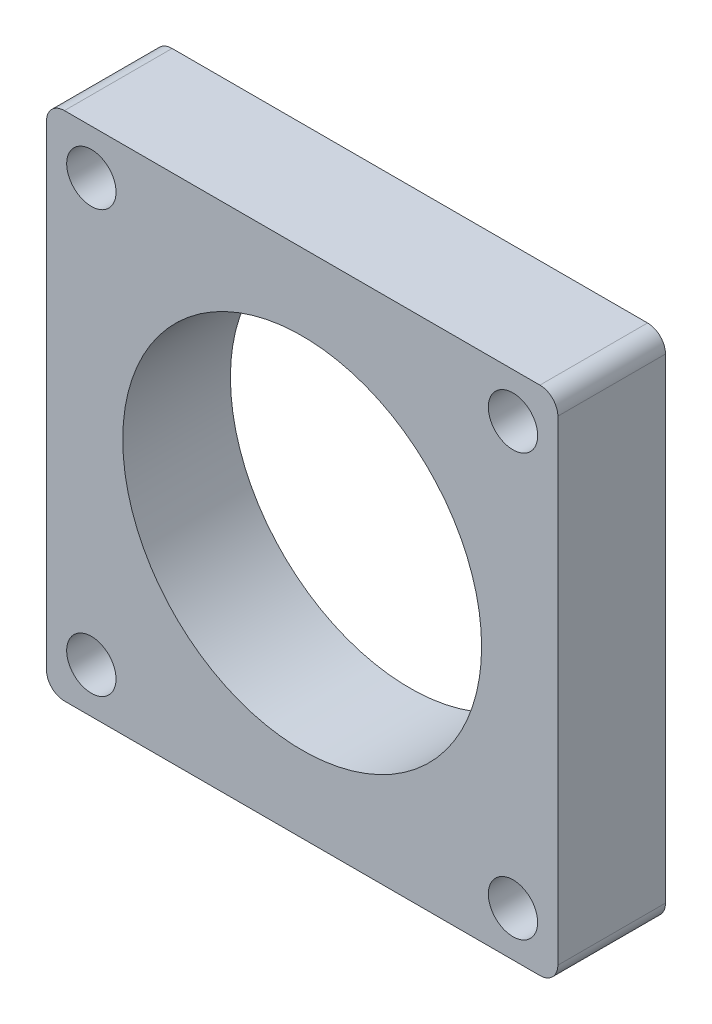
ISO-10303-21;
HEADER;
FILE_DESCRIPTION(('STEP AP214'),'2;1');
FILE_NAME('part.step','',(''),(''),'','','');
FILE_SCHEMA(('AUTOMOTIVE_DESIGN { 1 0 10303 214 1 1 1 1 }'));
ENDSEC;
DATA;
#1=APPLICATION_CONTEXT('core data for automotive mechanical design processes');
#2=APPLICATION_PROTOCOL_DEFINITION('international standard','automotive_design',2000,#1);
#3=PRODUCT_CONTEXT('',#1,'mechanical');
#4=PRODUCT('Part','Part','',(#3));
#5=PRODUCT_RELATED_PRODUCT_CATEGORY('part','',(#4));
#6=PRODUCT_DEFINITION_FORMATION('','',#4);
#7=PRODUCT_DEFINITION_CONTEXT('part definition',#1,'design');
#8=PRODUCT_DEFINITION('design','',#6,#7);
#9=PRODUCT_DEFINITION_SHAPE('','',#8);
#10=(LENGTH_UNIT() NAMED_UNIT(*) SI_UNIT(.MILLI.,.METRE.));
#11=(NAMED_UNIT(*) PLANE_ANGLE_UNIT() SI_UNIT($,.RADIAN.));
#12=(NAMED_UNIT(*) SI_UNIT($,.STERADIAN.) SOLID_ANGLE_UNIT());
#13=UNCERTAINTY_MEASURE_WITH_UNIT(LENGTH_MEASURE(1.E-05),#10,'distance_accuracy_value','');
#14=(GEOMETRIC_REPRESENTATION_CONTEXT(3) GLOBAL_UNCERTAINTY_ASSIGNED_CONTEXT((#13)) GLOBAL_UNIT_ASSIGNED_CONTEXT((#10,
#11,#12)) REPRESENTATION_CONTEXT('',''));
#15=CARTESIAN_POINT('',(0.,0.,0.));
#16=DIRECTION('',(0.,0.,1.));
#17=DIRECTION('',(1.,0.,0.));
#18=AXIS2_PLACEMENT_3D('',#15,#16,#17);
#19=CARTESIAN_POINT('',(0.,0.,12.));
#20=DIRECTION('',(0.,0.,1.));
#21=DIRECTION('',(1.,0.,0.));
#22=AXIS2_PLACEMENT_3D('',#19,#20,#21);
#23=PLANE('',#22);
#24=CARTESIAN_POINT('',(-23.4999989382731,-23.4999989382731,12.));
#25=DIRECTION('',(0.,0.,1.));
#26=DIRECTION('',(1.,0.,0.));
#27=AXIS2_PLACEMENT_3D('',#24,#25,#26);
#28=CIRCLE('',#27,2.75);
#29=CARTESIAN_POINT('',(-20.7499989382731,-23.4999989382731,12.));
#30=VERTEX_POINT('',#29);
#31=EDGE_CURVE('E261',#30,#30,#28,.T.);
#32=ORIENTED_EDGE('',*,*,#31,.F.);
#33=EDGE_LOOP('',(#32));
#34=FACE_BOUND('',#33,.T.);
#35=CARTESIAN_POINT('',(23.4999989382731,23.4999989382731,12.));
#36=DIRECTION('',(0.,0.,1.));
#37=DIRECTION('',(1.,0.,0.));
#38=AXIS2_PLACEMENT_3D('',#35,#36,#37);
#39=CIRCLE('',#38,2.75);
#40=CARTESIAN_POINT('',(26.2499989382731,23.4999989382731,12.));
#41=VERTEX_POINT('',#40);
#42=EDGE_CURVE('E277',#41,#41,#39,.T.);
#43=ORIENTED_EDGE('',*,*,#42,.F.);
#44=EDGE_LOOP('',(#43));
#45=FACE_BOUND('',#44,.T.);
#46=DIRECTION('',(0.,-1.,0.));
#47=VECTOR('',#46,1.);
#48=CARTESIAN_POINT('',(-28.5,28.5,12.));
#49=LINE('',#48,#47);
#50=CARTESIAN_POINT('',(-28.5,26.5,12.));
#51=VERTEX_POINT('',#50);
#52=CARTESIAN_POINT('',(-28.5,-26.5,12.));
#53=VERTEX_POINT('',#52);
#54=EDGE_CURVE('E181',#51,#53,#49,.T.);
#55=ORIENTED_EDGE('',*,*,#54,.T.);
#56=CARTESIAN_POINT('',(-26.5,-26.5,12.));
#57=DIRECTION('',(0.,0.,1.));
#58=DIRECTION('',(1.,0.,0.));
#59=AXIS2_PLACEMENT_3D('',#56,#57,#58);
#60=CIRCLE('',#59,2.);
#61=CARTESIAN_POINT('',(-26.5,-28.5,12.));
#62=VERTEX_POINT('',#61);
#63=EDGE_CURVE('E169',#53,#62,#60,.T.);
#64=ORIENTED_EDGE('',*,*,#63,.T.);
#65=DIRECTION('',(1.,0.,0.));
#66=VECTOR('',#65,1.);
#67=CARTESIAN_POINT('',(-28.5,-28.5,12.));
#68=LINE('',#67,#66);
#69=CARTESIAN_POINT('',(26.5,-28.5,12.));
#70=VERTEX_POINT('',#69);
#71=EDGE_CURVE('E127',#62,#70,#68,.T.);
#72=ORIENTED_EDGE('',*,*,#71,.T.);
#73=CARTESIAN_POINT('',(26.5,-26.5,12.));
#74=DIRECTION('',(0.,0.,1.));
#75=DIRECTION('',(1.,0.,0.));
#76=AXIS2_PLACEMENT_3D('',#73,#74,#75);
#77=CIRCLE('',#76,2.);
#78=CARTESIAN_POINT('',(28.5,-26.5,12.));
#79=VERTEX_POINT('',#78);
#80=EDGE_CURVE('E166',#70,#79,#77,.T.);
#81=ORIENTED_EDGE('',*,*,#80,.T.);
#82=DIRECTION('',(0.,1.,0.));
#83=VECTOR('',#82,1.);
#84=CARTESIAN_POINT('',(28.5,28.5,12.));
#85=LINE('',#84,#83);
#86=CARTESIAN_POINT('',(28.5,26.5,12.));
#87=VERTEX_POINT('',#86);
#88=EDGE_CURVE('E136',#79,#87,#85,.T.);
#89=ORIENTED_EDGE('',*,*,#88,.T.);
#90=CARTESIAN_POINT('',(26.5,26.5,12.));
#91=DIRECTION('',(0.,0.,1.));
#92=DIRECTION('',(1.,0.,0.));
#93=AXIS2_PLACEMENT_3D('',#90,#91,#92);
#94=CIRCLE('',#93,2.);
#95=CARTESIAN_POINT('',(26.5,28.5,12.));
#96=VERTEX_POINT('',#95);
#97=EDGE_CURVE('E61',#87,#96,#94,.T.);
#98=ORIENTED_EDGE('',*,*,#97,.T.);
#99=DIRECTION('',(-1.,0.,0.));
#100=VECTOR('',#99,1.);
#101=CARTESIAN_POINT('',(-28.5,28.5,12.));
#102=LINE('',#101,#100);
#103=CARTESIAN_POINT('',(-26.5,28.5,12.));
#104=VERTEX_POINT('',#103);
#105=EDGE_CURVE('E141',#96,#104,#102,.T.);
#106=ORIENTED_EDGE('',*,*,#105,.T.);
#107=CARTESIAN_POINT('',(-26.5,26.5,12.));
#108=DIRECTION('',(0.,0.,1.));
#109=DIRECTION('',(1.,0.,0.));
#110=AXIS2_PLACEMENT_3D('',#107,#108,#109);
#111=CIRCLE('',#110,2.);
#112=EDGE_CURVE('E161',#104,#51,#111,.T.);
#113=ORIENTED_EDGE('',*,*,#112,.T.);
#114=EDGE_LOOP('',(#55,#64,#72,#81,#89,#98,#106,#113));
#115=FACE_BOUND('',#114,.T.);
#116=CARTESIAN_POINT('',(-23.5000010617269,23.5000010617269,12.));
#117=DIRECTION('',(0.,0.,1.));
#118=DIRECTION('',(1.,0.,0.));
#119=AXIS2_PLACEMENT_3D('',#116,#117,#118);
#120=CIRCLE('',#119,2.75);
#121=CARTESIAN_POINT('',(-20.7500010617269,23.5000010617269,12.));
#122=VERTEX_POINT('',#121);
#123=EDGE_CURVE('E193',#122,#122,#120,.T.);
#124=ORIENTED_EDGE('',*,*,#123,.F.);
#125=EDGE_LOOP('',(#124));
#126=FACE_BOUND('',#125,.T.);
#127=CARTESIAN_POINT('',(23.5000010617269,-23.5000010617269,12.));
#128=DIRECTION('',(0.,0.,1.));
#129=DIRECTION('',(1.,0.,0.));
#130=AXIS2_PLACEMENT_3D('',#127,#128,#129);
#131=CIRCLE('',#130,2.75);
#132=CARTESIAN_POINT('',(26.2500010617269,-23.5000010617269,12.));
#133=VERTEX_POINT('',#132);
#134=EDGE_CURVE('E269',#133,#133,#131,.T.);
#135=ORIENTED_EDGE('',*,*,#134,.F.);
#136=EDGE_LOOP('',(#135));
#137=FACE_BOUND('',#136,.T.);
#138=CARTESIAN_POINT('',(0.,0.,12.));
#139=DIRECTION('',(0.,0.,1.));
#140=DIRECTION('',(1.,0.,0.));
#141=AXIS2_PLACEMENT_3D('',#138,#139,#140);
#142=CIRCLE('',#141,20.);
#143=CARTESIAN_POINT('',(20.,0.,12.));
#144=VERTEX_POINT('',#143);
#145=EDGE_CURVE('E250',#144,#144,#142,.T.);
#146=ORIENTED_EDGE('',*,*,#145,.F.);
#147=EDGE_LOOP('',(#146));
#148=FACE_BOUND('',#147,.T.);
#149=ADVANCED_FACE('F39',(#34,#45,#115,#126,#137,#148),#23,.T.);
#150=CARTESIAN_POINT('',(0.,0.,0.));
#151=DIRECTION('',(0.,0.,1.));
#152=DIRECTION('',(1.,0.,0.));
#153=AXIS2_PLACEMENT_3D('',#150,#151,#152);
#154=PLANE('',#153);
#155=DIRECTION('',(1.,0.,0.));
#156=VECTOR('',#155,1.);
#157=CARTESIAN_POINT('',(-28.5,-28.5,0.));
#158=LINE('',#157,#156);
#159=CARTESIAN_POINT('',(-26.5,-28.5,0.));
#160=VERTEX_POINT('',#159);
#161=CARTESIAN_POINT('',(26.5,-28.5,0.));
#162=VERTEX_POINT('',#161);
#163=EDGE_CURVE('E124',#160,#162,#158,.T.);
#164=ORIENTED_EDGE('',*,*,#163,.F.);
#165=CARTESIAN_POINT('',(-26.5,-26.5,0.));
#166=DIRECTION('',(0.,0.,1.));
#167=DIRECTION('',(1.,0.,0.));
#168=AXIS2_PLACEMENT_3D('',#165,#166,#167);
#169=CIRCLE('',#168,2.);
#170=CARTESIAN_POINT('',(-28.5,-26.5,0.));
#171=VERTEX_POINT('',#170);
#172=EDGE_CURVE('E106',#160,#171,#169,.F.);
#173=ORIENTED_EDGE('',*,*,#172,.T.);
#174=DIRECTION('',(0.,-1.,0.));
#175=VECTOR('',#174,1.);
#176=CARTESIAN_POINT('',(-28.5,28.5,0.));
#177=LINE('',#176,#175);
#178=CARTESIAN_POINT('',(-28.5,26.5,0.));
#179=VERTEX_POINT('',#178);
#180=EDGE_CURVE('E137',#179,#171,#177,.T.);
#181=ORIENTED_EDGE('',*,*,#180,.F.);
#182=CARTESIAN_POINT('',(-26.5,26.5,0.));
#183=DIRECTION('',(0.,0.,1.));
#184=DIRECTION('',(1.,0.,0.));
#185=AXIS2_PLACEMENT_3D('',#182,#183,#184);
#186=CIRCLE('',#185,2.);
#187=CARTESIAN_POINT('',(-26.5,28.5,0.));
#188=VERTEX_POINT('',#187);
#189=EDGE_CURVE('E129',#179,#188,#186,.F.);
#190=ORIENTED_EDGE('',*,*,#189,.T.);
#191=DIRECTION('',(-1.,0.,0.));
#192=VECTOR('',#191,1.);
#193=CARTESIAN_POINT('',(-28.5,28.5,0.));
#194=LINE('',#193,#192);
#195=CARTESIAN_POINT('',(26.5,28.5,0.));
#196=VERTEX_POINT('',#195);
#197=EDGE_CURVE('E143',#196,#188,#194,.T.);
#198=ORIENTED_EDGE('',*,*,#197,.F.);
#199=CARTESIAN_POINT('',(26.5,26.5,0.));
#200=DIRECTION('',(0.,0.,1.));
#201=DIRECTION('',(1.,0.,0.));
#202=AXIS2_PLACEMENT_3D('',#199,#200,#201);
#203=CIRCLE('',#202,2.);
#204=CARTESIAN_POINT('',(28.5,26.5,0.));
#205=VERTEX_POINT('',#204);
#206=EDGE_CURVE('E151',#196,#205,#203,.F.);
#207=ORIENTED_EDGE('',*,*,#206,.T.);
#208=DIRECTION('',(0.,1.,0.));
#209=VECTOR('',#208,1.);
#210=CARTESIAN_POINT('',(28.5,28.5,0.));
#211=LINE('',#210,#209);
#212=CARTESIAN_POINT('',(28.5,-26.5,0.));
#213=VERTEX_POINT('',#212);
#214=EDGE_CURVE('E190',#213,#205,#211,.T.);
#215=ORIENTED_EDGE('',*,*,#214,.F.);
#216=CARTESIAN_POINT('',(26.5,-26.5,0.));
#217=DIRECTION('',(0.,0.,1.));
#218=DIRECTION('',(1.,0.,0.));
#219=AXIS2_PLACEMENT_3D('',#216,#217,#218);
#220=CIRCLE('',#219,2.);
#221=EDGE_CURVE('E118',#213,#162,#220,.F.);
#222=ORIENTED_EDGE('',*,*,#221,.T.);
#223=EDGE_LOOP('',(#164,#173,#181,#190,#198,#207,#215,#222));
#224=FACE_BOUND('',#223,.T.);
#225=CARTESIAN_POINT('',(-23.5000010617269,23.5000010617269,0.));
#226=DIRECTION('',(0.,0.,1.));
#227=DIRECTION('',(1.,0.,0.));
#228=AXIS2_PLACEMENT_3D('',#225,#226,#227);
#229=CIRCLE('',#228,2.75);
#230=CARTESIAN_POINT('',(-20.7500010617269,23.5000010617269,0.));
#231=VERTEX_POINT('',#230);
#232=EDGE_CURVE('E281',#231,#231,#229,.T.);
#233=ORIENTED_EDGE('',*,*,#232,.T.);
#234=EDGE_LOOP('',(#233));
#235=FACE_BOUND('',#234,.T.);
#236=CARTESIAN_POINT('',(23.4999989382731,23.4999989382731,0.));
#237=DIRECTION('',(0.,0.,1.));
#238=DIRECTION('',(1.,0.,0.));
#239=AXIS2_PLACEMENT_3D('',#236,#237,#238);
#240=CIRCLE('',#239,2.75);
#241=CARTESIAN_POINT('',(26.2499989382731,23.4999989382731,0.));
#242=VERTEX_POINT('',#241);
#243=EDGE_CURVE('E273',#242,#242,#240,.T.);
#244=ORIENTED_EDGE('',*,*,#243,.T.);
#245=EDGE_LOOP('',(#244));
#246=FACE_BOUND('',#245,.T.);
#247=CARTESIAN_POINT('',(23.5000010617269,-23.5000010617269,0.));
#248=DIRECTION('',(0.,0.,1.));
#249=DIRECTION('',(1.,0.,0.));
#250=AXIS2_PLACEMENT_3D('',#247,#248,#249);
#251=CIRCLE('',#250,2.75);
#252=CARTESIAN_POINT('',(26.2500010617269,-23.5000010617269,0.));
#253=VERTEX_POINT('',#252);
#254=EDGE_CURVE('E265',#253,#253,#251,.T.);
#255=ORIENTED_EDGE('',*,*,#254,.T.);
#256=EDGE_LOOP('',(#255));
#257=FACE_BOUND('',#256,.T.);
#258=CARTESIAN_POINT('',(-23.4999989382731,-23.4999989382731,0.));
#259=DIRECTION('',(0.,0.,1.));
#260=DIRECTION('',(1.,0.,0.));
#261=AXIS2_PLACEMENT_3D('',#258,#259,#260);
#262=CIRCLE('',#261,2.75);
#263=CARTESIAN_POINT('',(-20.7499989382731,-23.4999989382731,0.));
#264=VERTEX_POINT('',#263);
#265=EDGE_CURVE('E258',#264,#264,#262,.T.);
#266=ORIENTED_EDGE('',*,*,#265,.T.);
#267=EDGE_LOOP('',(#266));
#268=FACE_BOUND('',#267,.T.);
#269=CARTESIAN_POINT('',(0.,0.,0.));
#270=DIRECTION('',(0.,0.,1.));
#271=DIRECTION('',(1.,0.,0.));
#272=AXIS2_PLACEMENT_3D('',#269,#270,#271);
#273=CIRCLE('',#272,20.);
#274=CARTESIAN_POINT('',(20.,0.,0.));
#275=VERTEX_POINT('',#274);
#276=EDGE_CURVE('E253',#275,#275,#273,.T.);
#277=ORIENTED_EDGE('',*,*,#276,.T.);
#278=EDGE_LOOP('',(#277));
#279=FACE_BOUND('',#278,.T.);
#280=ADVANCED_FACE('F132',(#224,#235,#246,#257,#268,#279),#154,.F.);
#281=CARTESIAN_POINT('',(28.5,28.5,12.));
#282=DIRECTION('',(-1.,0.,0.));
#283=DIRECTION('',(0.,-1.,0.));
#284=AXIS2_PLACEMENT_3D('',#281,#282,#283);
#285=PLANE('',#284);
#286=ORIENTED_EDGE('',*,*,#88,.F.);
#287=DIRECTION('',(0.,0.,-1.));
#288=VECTOR('',#287,1.);
#289=CARTESIAN_POINT('',(28.5,-26.5,12.));
#290=LINE('',#289,#288);
#291=EDGE_CURVE('E175',#79,#213,#290,.T.);
#292=ORIENTED_EDGE('',*,*,#291,.T.);
#293=ORIENTED_EDGE('',*,*,#214,.T.);
#294=DIRECTION('',(0.,0.,-1.));
#295=VECTOR('',#294,1.);
#296=CARTESIAN_POINT('',(28.5,26.5,12.));
#297=LINE('',#296,#295);
#298=EDGE_CURVE('E172',#205,#87,#297,.F.);
#299=ORIENTED_EDGE('',*,*,#298,.T.);
#300=EDGE_LOOP('',(#286,#292,#293,#299));
#301=FACE_BOUND('',#300,.T.);
#302=ADVANCED_FACE('F212',(#301),#285,.F.);
#303=CARTESIAN_POINT('',(-28.5,28.5,12.));
#304=DIRECTION('',(0.,-1.,0.));
#305=DIRECTION('',(0.,0.,-1.));
#306=AXIS2_PLACEMENT_3D('',#303,#304,#305);
#307=PLANE('',#306);
#308=ORIENTED_EDGE('',*,*,#105,.F.);
#309=DIRECTION('',(0.,0.,-1.));
#310=VECTOR('',#309,1.);
#311=CARTESIAN_POINT('',(26.5,28.5,12.));
#312=LINE('',#311,#310);
#313=EDGE_CURVE('E11',#96,#196,#312,.T.);
#314=ORIENTED_EDGE('',*,*,#313,.T.);
#315=ORIENTED_EDGE('',*,*,#197,.T.);
#316=DIRECTION('',(0.,0.,-1.));
#317=VECTOR('',#316,1.);
#318=CARTESIAN_POINT('',(-26.5,28.5,12.));
#319=LINE('',#318,#317);
#320=EDGE_CURVE('E48',#188,#104,#319,.F.);
#321=ORIENTED_EDGE('',*,*,#320,.T.);
#322=EDGE_LOOP('',(#308,#314,#315,#321));
#323=FACE_BOUND('',#322,.T.);
#324=ADVANCED_FACE('F196',(#323),#307,.F.);
#325=CARTESIAN_POINT('',(-28.5,28.5,12.));
#326=DIRECTION('',(1.,0.,0.));
#327=DIRECTION('',(0.,1.,0.));
#328=AXIS2_PLACEMENT_3D('',#325,#326,#327);
#329=PLANE('',#328);
#330=ORIENTED_EDGE('',*,*,#180,.T.);
#331=DIRECTION('',(0.,0.,-1.));
#332=VECTOR('',#331,1.);
#333=CARTESIAN_POINT('',(-28.5,-26.5,12.));
#334=LINE('',#333,#332);
#335=EDGE_CURVE('E111',#171,#53,#334,.F.);
#336=ORIENTED_EDGE('',*,*,#335,.T.);
#337=ORIENTED_EDGE('',*,*,#54,.F.);
#338=DIRECTION('',(0.,0.,-1.));
#339=VECTOR('',#338,1.);
#340=CARTESIAN_POINT('',(-28.5,26.5,12.));
#341=LINE('',#340,#339);
#342=EDGE_CURVE('E117',#51,#179,#341,.T.);
#343=ORIENTED_EDGE('',*,*,#342,.T.);
#344=EDGE_LOOP('',(#330,#336,#337,#343));
#345=FACE_BOUND('',#344,.T.);
#346=ADVANCED_FACE('F203',(#345),#329,.F.);
#347=CARTESIAN_POINT('',(-28.5,-28.5,12.));
#348=DIRECTION('',(0.,1.,0.));
#349=DIRECTION('',(0.,0.,1.));
#350=AXIS2_PLACEMENT_3D('',#347,#348,#349);
#351=PLANE('',#350);
#352=ORIENTED_EDGE('',*,*,#71,.F.);
#353=DIRECTION('',(0.,0.,-1.));
#354=VECTOR('',#353,1.);
#355=CARTESIAN_POINT('',(-26.5,-28.5,12.));
#356=LINE('',#355,#354);
#357=EDGE_CURVE('E110',#62,#160,#356,.T.);
#358=ORIENTED_EDGE('',*,*,#357,.T.);
#359=ORIENTED_EDGE('',*,*,#163,.T.);
#360=DIRECTION('',(0.,0.,-1.));
#361=VECTOR('',#360,1.);
#362=CARTESIAN_POINT('',(26.5,-28.5,12.));
#363=LINE('',#362,#361);
#364=EDGE_CURVE('E130',#162,#70,#363,.F.);
#365=ORIENTED_EDGE('',*,*,#364,.T.);
#366=EDGE_LOOP('',(#352,#358,#359,#365));
#367=FACE_BOUND('',#366,.T.);
#368=ADVANCED_FACE('F123',(#367),#351,.F.);
#369=CARTESIAN_POINT('',(-23.5000010617269,23.5000010617269,12.));
#370=DIRECTION('',(0.,0.,-1.));
#371=DIRECTION('',(-1.,0.,0.));
#372=AXIS2_PLACEMENT_3D('',#369,#370,#371);
#373=CYLINDRICAL_SURFACE('',#372,2.75);
#374=ORIENTED_EDGE('',*,*,#123,.T.);
#375=EDGE_LOOP('',(#374));
#376=FACE_BOUND('',#375,.T.);
#377=ORIENTED_EDGE('',*,*,#232,.F.);
#378=EDGE_LOOP('',(#377));
#379=FACE_BOUND('',#378,.T.);
#380=ADVANCED_FACE('F210',(#376,#379),#373,.F.);
#381=CARTESIAN_POINT('',(23.4999989382731,23.4999989382731,12.));
#382=DIRECTION('',(0.,0.,-1.));
#383=DIRECTION('',(-1.,0.,0.));
#384=AXIS2_PLACEMENT_3D('',#381,#382,#383);
#385=CYLINDRICAL_SURFACE('',#384,2.75);
#386=ORIENTED_EDGE('',*,*,#42,.T.);
#387=EDGE_LOOP('',(#386));
#388=FACE_BOUND('',#387,.T.);
#389=ORIENTED_EDGE('',*,*,#243,.F.);
#390=EDGE_LOOP('',(#389));
#391=FACE_BOUND('',#390,.T.);
#392=ADVANCED_FACE('F226',(#388,#391),#385,.F.);
#393=CARTESIAN_POINT('',(23.5000010617269,-23.5000010617269,12.));
#394=DIRECTION('',(0.,0.,-1.));
#395=DIRECTION('',(-1.,0.,0.));
#396=AXIS2_PLACEMENT_3D('',#393,#394,#395);
#397=CYLINDRICAL_SURFACE('',#396,2.75);
#398=ORIENTED_EDGE('',*,*,#134,.T.);
#399=EDGE_LOOP('',(#398));
#400=FACE_BOUND('',#399,.T.);
#401=ORIENTED_EDGE('',*,*,#254,.F.);
#402=EDGE_LOOP('',(#401));
#403=FACE_BOUND('',#402,.T.);
#404=ADVANCED_FACE('F230',(#400,#403),#397,.F.);
#405=CARTESIAN_POINT('',(-23.4999989382731,-23.4999989382731,12.));
#406=DIRECTION('',(0.,0.,-1.));
#407=DIRECTION('',(-1.,0.,0.));
#408=AXIS2_PLACEMENT_3D('',#405,#406,#407);
#409=CYLINDRICAL_SURFACE('',#408,2.75);
#410=ORIENTED_EDGE('',*,*,#31,.T.);
#411=EDGE_LOOP('',(#410));
#412=FACE_BOUND('',#411,.T.);
#413=ORIENTED_EDGE('',*,*,#265,.F.);
#414=EDGE_LOOP('',(#413));
#415=FACE_BOUND('',#414,.T.);
#416=ADVANCED_FACE('F234',(#412,#415),#409,.F.);
#417=CARTESIAN_POINT('',(0.,0.,12.));
#418=DIRECTION('',(0.,0.,-1.));
#419=DIRECTION('',(-1.,0.,0.));
#420=AXIS2_PLACEMENT_3D('',#417,#418,#419);
#421=CYLINDRICAL_SURFACE('',#420,20.);
#422=ORIENTED_EDGE('',*,*,#145,.T.);
#423=EDGE_LOOP('',(#422));
#424=FACE_BOUND('',#423,.T.);
#425=ORIENTED_EDGE('',*,*,#276,.F.);
#426=EDGE_LOOP('',(#425));
#427=FACE_BOUND('',#426,.T.);
#428=ADVANCED_FACE('F238',(#424,#427),#421,.F.);
#429=CARTESIAN_POINT('',(-26.5,-26.5,12.));
#430=DIRECTION('',(0.,0.,-1.));
#431=DIRECTION('',(-1.,0.,0.));
#432=AXIS2_PLACEMENT_3D('',#429,#430,#431);
#433=CYLINDRICAL_SURFACE('',#432,2.);
#434=ORIENTED_EDGE('',*,*,#63,.F.);
#435=ORIENTED_EDGE('',*,*,#335,.F.);
#436=ORIENTED_EDGE('',*,*,#172,.F.);
#437=ORIENTED_EDGE('',*,*,#357,.F.);
#438=EDGE_LOOP('',(#434,#435,#436,#437));
#439=FACE_BOUND('',#438,.T.);
#440=ADVANCED_FACE('F109',(#439),#433,.T.);
#441=CARTESIAN_POINT('',(26.5,-26.5,12.));
#442=DIRECTION('',(0.,0.,-1.));
#443=DIRECTION('',(-1.,0.,0.));
#444=AXIS2_PLACEMENT_3D('',#441,#442,#443);
#445=CYLINDRICAL_SURFACE('',#444,2.);
#446=ORIENTED_EDGE('',*,*,#80,.F.);
#447=ORIENTED_EDGE('',*,*,#364,.F.);
#448=ORIENTED_EDGE('',*,*,#221,.F.);
#449=ORIENTED_EDGE('',*,*,#291,.F.);
#450=EDGE_LOOP('',(#446,#447,#448,#449));
#451=FACE_BOUND('',#450,.T.);
#452=ADVANCED_FACE('F245',(#451),#445,.T.);
#453=CARTESIAN_POINT('',(26.5,26.5,12.));
#454=DIRECTION('',(0.,0.,-1.));
#455=DIRECTION('',(-1.,0.,0.));
#456=AXIS2_PLACEMENT_3D('',#453,#454,#455);
#457=CYLINDRICAL_SURFACE('',#456,2.);
#458=ORIENTED_EDGE('',*,*,#97,.F.);
#459=ORIENTED_EDGE('',*,*,#298,.F.);
#460=ORIENTED_EDGE('',*,*,#206,.F.);
#461=ORIENTED_EDGE('',*,*,#313,.F.);
#462=EDGE_LOOP('',(#458,#459,#460,#461));
#463=FACE_BOUND('',#462,.T.);
#464=ADVANCED_FACE('F308',(#463),#457,.T.);
#465=CARTESIAN_POINT('',(-26.5,26.5,12.));
#466=DIRECTION('',(0.,0.,-1.));
#467=DIRECTION('',(-1.,0.,0.));
#468=AXIS2_PLACEMENT_3D('',#465,#466,#467);
#469=CYLINDRICAL_SURFACE('',#468,2.);
#470=ORIENTED_EDGE('',*,*,#112,.F.);
#471=ORIENTED_EDGE('',*,*,#320,.F.);
#472=ORIENTED_EDGE('',*,*,#189,.F.);
#473=ORIENTED_EDGE('',*,*,#342,.F.);
#474=EDGE_LOOP('',(#470,#471,#472,#473));
#475=FACE_BOUND('',#474,.T.);
#476=ADVANCED_FACE('F41',(#475),#469,.T.);
#477=CLOSED_SHELL('',(#149,#280,#302,#324,#346,#368,#380,#392,#404,#416,#428,#440,#452,#464,#476));
#478=MANIFOLD_SOLID_BREP('B2',#477);
#479=ADVANCED_BREP_SHAPE_REPRESENTATION('',(#18,#478),#14);
#480=SHAPE_DEFINITION_REPRESENTATION(#9,#479);
ENDSEC;
END-ISO-10303-21;
